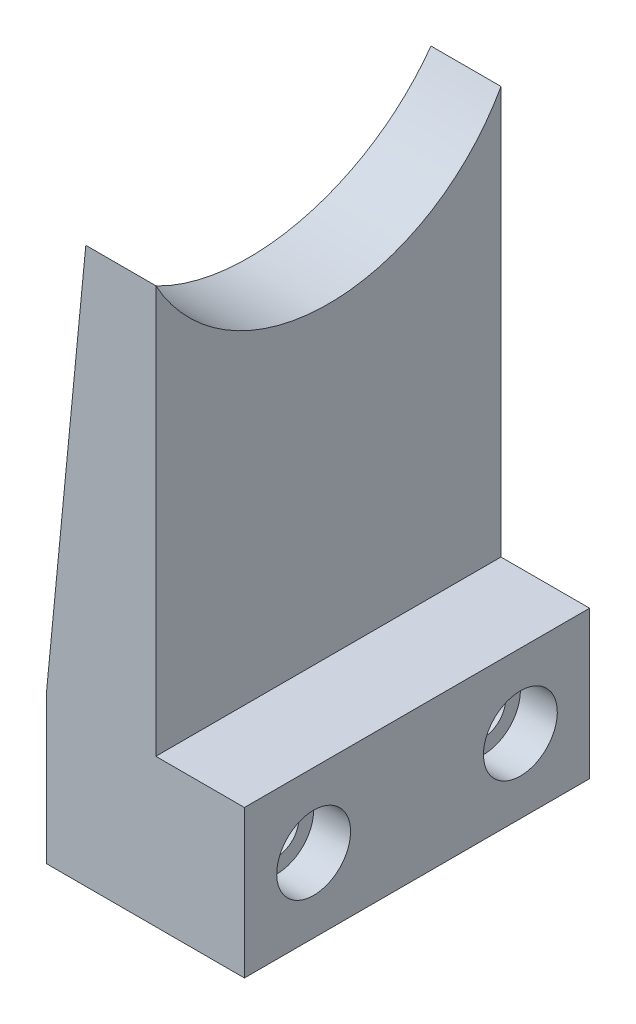
ISO-10303-21;
HEADER;
FILE_DESCRIPTION(('STEP AP214'),'2;1');
FILE_NAME('part.step','',(''),(''),'','','');
FILE_SCHEMA(('AUTOMOTIVE_DESIGN { 1 0 10303 214 1 1 1 1 }'));
ENDSEC;
DATA;
#1=APPLICATION_CONTEXT('core data for automotive mechanical design processes');
#2=APPLICATION_PROTOCOL_DEFINITION('international standard','automotive_design',2000,#1);
#3=PRODUCT_CONTEXT('',#1,'mechanical');
#4=PRODUCT('Part','Part','',(#3));
#5=PRODUCT_RELATED_PRODUCT_CATEGORY('part','',(#4));
#6=PRODUCT_DEFINITION_FORMATION('','',#4);
#7=PRODUCT_DEFINITION_CONTEXT('part definition',#1,'design');
#8=PRODUCT_DEFINITION('design','',#6,#7);
#9=PRODUCT_DEFINITION_SHAPE('','',#8);
#10=(LENGTH_UNIT() NAMED_UNIT(*) SI_UNIT(.MILLI.,.METRE.));
#11=(NAMED_UNIT(*) PLANE_ANGLE_UNIT() SI_UNIT($,.RADIAN.));
#12=(NAMED_UNIT(*) SI_UNIT($,.STERADIAN.) SOLID_ANGLE_UNIT());
#13=UNCERTAINTY_MEASURE_WITH_UNIT(LENGTH_MEASURE(1.E-05),#10,'distance_accuracy_value','');
#14=(GEOMETRIC_REPRESENTATION_CONTEXT(3) GLOBAL_UNCERTAINTY_ASSIGNED_CONTEXT((#13)) GLOBAL_UNIT_ASSIGNED_CONTEXT((#10,
#11,#12)) REPRESENTATION_CONTEXT('',''));
#15=CARTESIAN_POINT('',(0.,0.,0.));
#16=DIRECTION('',(0.,0.,1.));
#17=DIRECTION('',(1.,0.,0.));
#18=AXIS2_PLACEMENT_3D('',#15,#16,#17);
#19=CARTESIAN_POINT('',(0.,0.,35.0588586));
#20=DIRECTION('',(0.,0.,-1.));
#21=DIRECTION('',(-1.,0.,0.));
#22=AXIS2_PLACEMENT_3D('',#19,#20,#21);
#23=PLANE('',#22);
#24=DIRECTION('',(0.0961798870821656,0.995363968265308,0.));
#25=VECTOR('',#24,1.);
#26=CARTESIAN_POINT('',(-15.1396013361024,1.46290723132466,35.0588586));
#27=LINE('',#26,#25);
#28=CARTESIAN_POINT('',(-14.55625,7.49999999999998,35.0588586));
#29=VERTEX_POINT('',#28);
#30=CARTESIAN_POINT('',(-10.55625,48.89593,35.0588586));
#31=VERTEX_POINT('',#30);
#32=EDGE_CURVE('E155',#29,#31,#27,.T.);
#33=ORIENTED_EDGE('',*,*,#32,.F.);
#34=DIRECTION('',(0.,1.,0.));
#35=VECTOR('',#34,1.);
#36=CARTESIAN_POINT('',(-14.55625,0.,35.0588586));
#37=LINE('',#36,#35);
#38=CARTESIAN_POINT('',(-14.55625,-7.5,35.0588586));
#39=VERTEX_POINT('',#38);
#40=EDGE_CURVE('E153',#39,#29,#37,.T.);
#41=ORIENTED_EDGE('',*,*,#40,.F.);
#42=DIRECTION('',(-1.,0.,0.));
#43=VECTOR('',#42,1.);
#44=CARTESIAN_POINT('',(5.55625,-7.5,35.0588586));
#45=LINE('',#44,#43);
#46=CARTESIAN_POINT('',(5.55625,-7.5,35.0588586));
#47=VERTEX_POINT('',#46);
#48=EDGE_CURVE('E209',#47,#39,#45,.T.);
#49=ORIENTED_EDGE('',*,*,#48,.F.);
#50=DIRECTION('',(0.,-1.,0.));
#51=VECTOR('',#50,1.);
#52=CARTESIAN_POINT('',(5.55625,7.5,35.0588586));
#53=LINE('',#52,#51);
#54=CARTESIAN_POINT('',(5.55625,7.5,35.0588586));
#55=VERTEX_POINT('',#54);
#56=EDGE_CURVE('E206',#55,#47,#53,.T.);
#57=ORIENTED_EDGE('',*,*,#56,.F.);
#58=DIRECTION('',(-1.,0.,0.));
#59=VECTOR('',#58,1.);
#60=CARTESIAN_POINT('',(5.55625,7.5,35.0588586));
#61=LINE('',#60,#59);
#62=CARTESIAN_POINT('',(-3.44375,7.5,35.0588586));
#63=VERTEX_POINT('',#62);
#64=EDGE_CURVE('E212',#55,#63,#61,.T.);
#65=ORIENTED_EDGE('',*,*,#64,.T.);
#66=DIRECTION('',(0.,-1.,0.));
#67=VECTOR('',#66,1.);
#68=CARTESIAN_POINT('',(-3.44375,7.5,35.0588586));
#69=LINE('',#68,#67);
#70=CARTESIAN_POINT('',(-3.44375,48.89593,35.0588586));
#71=VERTEX_POINT('',#70);
#72=EDGE_CURVE('E296',#71,#63,#69,.T.);
#73=ORIENTED_EDGE('',*,*,#72,.F.);
#74=DIRECTION('',(1.,0.,0.));
#75=VECTOR('',#74,1.);
#76=CARTESIAN_POINT('',(-68.8033382803833,48.89593,35.0588586));
#77=LINE('',#76,#75);
#78=EDGE_CURVE('E143',#31,#71,#77,.T.);
#79=ORIENTED_EDGE('',*,*,#78,.F.);
#80=EDGE_LOOP('',(#33,#41,#49,#57,#65,#73,#79));
#81=FACE_BOUND('',#80,.T.);
#82=ADVANCED_FACE('F45',(#81),#23,.F.);
#83=CARTESIAN_POINT('',(0.,0.,0.));
#84=DIRECTION('',(0.,0.,-1.));
#85=DIRECTION('',(-1.,0.,0.));
#86=AXIS2_PLACEMENT_3D('',#83,#84,#85);
#87=PLANE('',#86);
#88=DIRECTION('',(0.,-1.,0.));
#89=VECTOR('',#88,1.);
#90=CARTESIAN_POINT('',(-14.55625,0.,0.));
#91=LINE('',#90,#89);
#92=CARTESIAN_POINT('',(-14.55625,7.50000000000004,0.));
#93=VERTEX_POINT('',#92);
#94=CARTESIAN_POINT('',(-14.55625,-7.5,0.));
#95=VERTEX_POINT('',#94);
#96=EDGE_CURVE('E178',#93,#95,#91,.T.);
#97=ORIENTED_EDGE('',*,*,#96,.F.);
#98=DIRECTION('',(0.0961798870821656,0.995363968265308,0.));
#99=VECTOR('',#98,1.);
#100=CARTESIAN_POINT('',(-15.1396013361024,1.46290723132466,0.));
#101=LINE('',#100,#99);
#102=CARTESIAN_POINT('',(-10.55625,48.89593,0.));
#103=VERTEX_POINT('',#102);
#104=EDGE_CURVE('E303',#93,#103,#101,.T.);
#105=ORIENTED_EDGE('',*,*,#104,.T.);
#106=DIRECTION('',(1.,0.,0.));
#107=VECTOR('',#106,1.);
#108=CARTESIAN_POINT('',(-68.8033382803833,48.89593,0.));
#109=LINE('',#108,#107);
#110=CARTESIAN_POINT('',(-3.44375,48.89593,0.));
#111=VERTEX_POINT('',#110);
#112=EDGE_CURVE('E142',#103,#111,#109,.T.);
#113=ORIENTED_EDGE('',*,*,#112,.T.);
#114=DIRECTION('',(0.,1.,0.));
#115=VECTOR('',#114,1.);
#116=CARTESIAN_POINT('',(-3.44375,7.5,0.));
#117=LINE('',#116,#115);
#118=CARTESIAN_POINT('',(-3.44375,7.5,0.));
#119=VERTEX_POINT('',#118);
#120=EDGE_CURVE('E154',#119,#111,#117,.T.);
#121=ORIENTED_EDGE('',*,*,#120,.F.);
#122=DIRECTION('',(-1.,0.,0.));
#123=VECTOR('',#122,1.);
#124=CARTESIAN_POINT('',(5.55625,7.5,0.));
#125=LINE('',#124,#123);
#126=CARTESIAN_POINT('',(5.55625,7.5,0.));
#127=VERTEX_POINT('',#126);
#128=EDGE_CURVE('E210',#127,#119,#125,.T.);
#129=ORIENTED_EDGE('',*,*,#128,.F.);
#130=DIRECTION('',(0.,-1.,0.));
#131=VECTOR('',#130,1.);
#132=CARTESIAN_POINT('',(5.55625,7.5,0.));
#133=LINE('',#132,#131);
#134=CARTESIAN_POINT('',(5.55625,-7.5,0.));
#135=VERTEX_POINT('',#134);
#136=EDGE_CURVE('E202',#127,#135,#133,.T.);
#137=ORIENTED_EDGE('',*,*,#136,.T.);
#138=DIRECTION('',(-1.,0.,0.));
#139=VECTOR('',#138,1.);
#140=CARTESIAN_POINT('',(5.55625,-7.5,0.));
#141=LINE('',#140,#139);
#142=EDGE_CURVE('E217',#135,#95,#141,.T.);
#143=ORIENTED_EDGE('',*,*,#142,.T.);
#144=EDGE_LOOP('',(#97,#105,#113,#121,#129,#137,#143));
#145=FACE_BOUND('',#144,.T.);
#146=ADVANCED_FACE('F249',(#145),#87,.T.);
#147=CARTESIAN_POINT('',(-14.55625,0.,0.));
#148=DIRECTION('',(-1.,0.,0.));
#149=DIRECTION('',(0.,-1.,0.));
#150=AXIS2_PLACEMENT_3D('',#147,#148,#149);
#151=PLANE('',#150);
#152=ORIENTED_EDGE('',*,*,#40,.T.);
#153=DIRECTION('',(0.,0.,-1.));
#154=VECTOR('',#153,1.);
#155=CARTESIAN_POINT('',(-14.55625,7.50000000000004,0.));
#156=LINE('',#155,#154);
#157=CARTESIAN_POINT('',(-14.55625,7.49999999999999,32.5294293));
#158=VERTEX_POINT('',#157);
#159=EDGE_CURVE('E134',#29,#158,#156,.T.);
#160=ORIENTED_EDGE('',*,*,#159,.T.);
#161=DIRECTION('',(0.,-1.,0.));
#162=VECTOR('',#161,1.);
#163=CARTESIAN_POINT('',(-14.55625,0.,32.5294293));
#164=LINE('',#163,#162);
#165=CARTESIAN_POINT('',(-14.55625,-7.5,32.5294293));
#166=VERTEX_POINT('',#165);
#167=EDGE_CURVE('E150',#158,#166,#164,.T.);
#168=ORIENTED_EDGE('',*,*,#167,.T.);
#169=DIRECTION('',(0.,0.,1.));
#170=VECTOR('',#169,1.);
#171=CARTESIAN_POINT('',(-14.55625,-7.5,0.));
#172=LINE('',#171,#170);
#173=EDGE_CURVE('E163',#166,#39,#172,.T.);
#174=ORIENTED_EDGE('',*,*,#173,.T.);
#175=EDGE_LOOP('',(#152,#160,#168,#174));
#176=FACE_BOUND('',#175,.T.);
#177=ADVANCED_FACE('F148',(#176),#151,.T.);
#178=DIRECTION('',(0.,-1.,0.));
#179=VECTOR('',#178,1.);
#180=CARTESIAN_POINT('',(-14.55625,0.,2.5294293));
#181=LINE('',#180,#179);
#182=CARTESIAN_POINT('',(-14.55625,7.5,2.5294293));
#183=VERTEX_POINT('',#182);
#184=CARTESIAN_POINT('',(-14.55625,-7.5,2.5294293));
#185=VERTEX_POINT('',#184);
#186=EDGE_CURVE('E171',#183,#185,#181,.T.);
#187=ORIENTED_EDGE('',*,*,#186,.F.);
#188=EDGE_CURVE('E137',#183,#93,#156,.T.);
#189=ORIENTED_EDGE('',*,*,#188,.T.);
#190=ORIENTED_EDGE('',*,*,#96,.T.);
#191=DIRECTION('',(0.,0.,1.));
#192=VECTOR('',#191,1.);
#193=CARTESIAN_POINT('',(-14.55625,-7.5,0.));
#194=LINE('',#193,#192);
#195=EDGE_CURVE('E180',#95,#185,#194,.T.);
#196=ORIENTED_EDGE('',*,*,#195,.T.);
#197=EDGE_LOOP('',(#187,#189,#190,#196));
#198=FACE_BOUND('',#197,.T.);
#199=ADVANCED_FACE('F306',(#198),#151,.T.);
#200=CARTESIAN_POINT('',(-68.8033382803833,58.5250061974502,17.5294293));
#201=DIRECTION('',(1.,0.,0.));
#202=DIRECTION('',(0.,1.,0.));
#203=AXIS2_PLACEMENT_3D('',#200,#201,#202);
#204=CYLINDRICAL_SURFACE('',#203,20.);
#205=ORIENTED_EDGE('',*,*,#112,.F.);
#206=CARTESIAN_POINT('',(-9.62581300317928,58.5250061974502,17.5294293));
#207=DIRECTION('',(-0.995363968265308,0.0961798870821656,0.));
#208=DIRECTION('',(0.0961798870821656,0.995363968265308,0.));
#209=AXIS2_PLACEMENT_3D('',#206,#207,#208);
#210=ELLIPSE('',#209,20.0931524926057,20.);
#211=EDGE_CURVE('E300',#103,#31,#210,.T.);
#212=ORIENTED_EDGE('',*,*,#211,.T.);
#213=ORIENTED_EDGE('',*,*,#78,.T.);
#214=CARTESIAN_POINT('',(-3.44375000000001,58.5250061974502,17.5294293));
#215=DIRECTION('',(-1.,0.,0.));
#216=DIRECTION('',(0.,1.,0.));
#217=AXIS2_PLACEMENT_3D('',#214,#215,#216);
#218=CIRCLE('',#217,20.);
#219=EDGE_CURVE('E293',#111,#71,#218,.T.);
#220=ORIENTED_EDGE('',*,*,#219,.F.);
#221=EDGE_LOOP('',(#205,#212,#213,#220));
#222=FACE_BOUND('',#221,.T.);
#223=ADVANCED_FACE('F259',(#222),#204,.F.);
#224=CARTESIAN_POINT('',(5.55625,7.5,35.0588586));
#225=DIRECTION('',(0.,-1.,0.));
#226=DIRECTION('',(1.,0.,0.));
#227=AXIS2_PLACEMENT_3D('',#224,#225,#226);
#228=PLANE('',#227);
#229=DIRECTION('',(0.,0.,-1.));
#230=VECTOR('',#229,1.);
#231=CARTESIAN_POINT('',(-3.44375,7.5,0.));
#232=LINE('',#231,#230);
#233=EDGE_CURVE('E62',#63,#119,#232,.T.);
#234=ORIENTED_EDGE('',*,*,#233,.F.);
#235=ORIENTED_EDGE('',*,*,#64,.F.);
#236=DIRECTION('',(0.,0.,-1.));
#237=VECTOR('',#236,1.);
#238=CARTESIAN_POINT('',(5.55625,7.5,35.0588586));
#239=LINE('',#238,#237);
#240=EDGE_CURVE('E11',#55,#127,#239,.T.);
#241=ORIENTED_EDGE('',*,*,#240,.T.);
#242=ORIENTED_EDGE('',*,*,#128,.T.);
#243=EDGE_LOOP('',(#234,#235,#241,#242));
#244=FACE_BOUND('',#243,.T.);
#245=ADVANCED_FACE('F243',(#244),#228,.F.);
#246=CARTESIAN_POINT('',(-5.55625,7.5,35.0588586));
#247=DIRECTION('',(1.,0.,0.));
#248=DIRECTION('',(0.,1.,0.));
#249=AXIS2_PLACEMENT_3D('',#246,#247,#248);
#250=PLANE('',#249);
#251=CARTESIAN_POINT('',(-5.55625,0.,7.0294293));
#252=DIRECTION('',(1.,0.,0.));
#253=DIRECTION('',(0.,1.,0.));
#254=AXIS2_PLACEMENT_3D('',#251,#252,#253);
#255=CIRCLE('',#254,2.25);
#256=CARTESIAN_POINT('',(-5.55625,2.25000000000001,7.0294293));
#257=VERTEX_POINT('',#256);
#258=EDGE_CURVE('E203',#257,#257,#255,.T.);
#259=ORIENTED_EDGE('',*,*,#258,.T.);
#260=EDGE_LOOP('',(#259));
#261=FACE_BOUND('',#260,.T.);
#262=CARTESIAN_POINT('',(-5.55625,0.,28.0294293));
#263=DIRECTION('',(1.,0.,0.));
#264=DIRECTION('',(0.,1.,0.));
#265=AXIS2_PLACEMENT_3D('',#262,#263,#264);
#266=CIRCLE('',#265,2.25);
#267=CARTESIAN_POINT('',(-5.55625,2.25,28.0294293));
#268=VERTEX_POINT('',#267);
#269=EDGE_CURVE('E199',#268,#268,#266,.T.);
#270=ORIENTED_EDGE('',*,*,#269,.T.);
#271=EDGE_LOOP('',(#270));
#272=FACE_BOUND('',#271,.T.);
#273=DIRECTION('',(0.,-1.,0.));
#274=VECTOR('',#273,1.);
#275=CARTESIAN_POINT('',(-5.55625,0.,32.5294293));
#276=LINE('',#275,#274);
#277=CARTESIAN_POINT('',(-5.55625,7.5,32.5294293));
#278=VERTEX_POINT('',#277);
#279=CARTESIAN_POINT('',(-5.55625,-7.5,32.5294293));
#280=VERTEX_POINT('',#279);
#281=EDGE_CURVE('E164',#278,#280,#276,.T.);
#282=ORIENTED_EDGE('',*,*,#281,.F.);
#283=DIRECTION('',(0.,0.,-1.));
#284=VECTOR('',#283,1.);
#285=CARTESIAN_POINT('',(-5.55625,7.5,35.0588586));
#286=LINE('',#285,#284);
#287=CARTESIAN_POINT('',(-5.55625,7.5,2.5294293));
#288=VERTEX_POINT('',#287);
#289=EDGE_CURVE('E54',#278,#288,#286,.T.);
#290=ORIENTED_EDGE('',*,*,#289,.T.);
#291=DIRECTION('',(0.,-1.,0.));
#292=VECTOR('',#291,1.);
#293=CARTESIAN_POINT('',(-5.55625,0.,2.5294293));
#294=LINE('',#293,#292);
#295=CARTESIAN_POINT('',(-5.55625,-7.5,2.5294293));
#296=VERTEX_POINT('',#295);
#297=EDGE_CURVE('E168',#288,#296,#294,.T.);
#298=ORIENTED_EDGE('',*,*,#297,.T.);
#299=DIRECTION('',(0.,0.,-1.));
#300=VECTOR('',#299,1.);
#301=CARTESIAN_POINT('',(-5.55625,-7.5,35.0588586));
#302=LINE('',#301,#300);
#303=EDGE_CURVE('E70',#280,#296,#302,.T.);
#304=ORIENTED_EDGE('',*,*,#303,.F.);
#305=EDGE_LOOP('',(#282,#290,#298,#304));
#306=FACE_BOUND('',#305,.T.);
#307=ADVANCED_FACE('F234',(#261,#272,#306),#250,.F.);
#308=CARTESIAN_POINT('',(-5.55625,0.,7.0294293));
#309=DIRECTION('',(1.,0.,0.));
#310=DIRECTION('',(0.,1.,0.));
#311=AXIS2_PLACEMENT_3D('',#308,#309,#310);
#312=CYLINDRICAL_SURFACE('',#311,2.25);
#313=ORIENTED_EDGE('',*,*,#258,.F.);
#314=EDGE_LOOP('',(#313));
#315=FACE_BOUND('',#314,.T.);
#316=CARTESIAN_POINT('',(1.80625,0.,7.0294293));
#317=DIRECTION('',(1.,0.,0.));
#318=DIRECTION('',(0.,1.,0.));
#319=AXIS2_PLACEMENT_3D('',#316,#317,#318);
#320=CIRCLE('',#319,2.25);
#321=CARTESIAN_POINT('',(1.80625,2.25000000000001,7.0294293));
#322=VERTEX_POINT('',#321);
#323=EDGE_CURVE('E49',#322,#322,#320,.F.);
#324=ORIENTED_EDGE('',*,*,#323,.F.);
#325=EDGE_LOOP('',(#324));
#326=FACE_BOUND('',#325,.T.);
#327=ADVANCED_FACE('F231',(#315,#326),#312,.F.);
#328=CARTESIAN_POINT('',(-5.55625,0.,28.0294293));
#329=DIRECTION('',(1.,0.,0.));
#330=DIRECTION('',(0.,1.,0.));
#331=AXIS2_PLACEMENT_3D('',#328,#329,#330);
#332=CYLINDRICAL_SURFACE('',#331,2.25);
#333=ORIENTED_EDGE('',*,*,#269,.F.);
#334=EDGE_LOOP('',(#333));
#335=FACE_BOUND('',#334,.T.);
#336=CARTESIAN_POINT('',(1.80625,0.,28.0294293));
#337=DIRECTION('',(1.,0.,0.));
#338=DIRECTION('',(0.,1.,0.));
#339=AXIS2_PLACEMENT_3D('',#336,#337,#338);
#340=CIRCLE('',#339,2.25);
#341=CARTESIAN_POINT('',(1.80625,2.25,28.0294293));
#342=VERTEX_POINT('',#341);
#343=EDGE_CURVE('E190',#342,#342,#340,.F.);
#344=ORIENTED_EDGE('',*,*,#343,.F.);
#345=EDGE_LOOP('',(#344));
#346=FACE_BOUND('',#345,.T.);
#347=ADVANCED_FACE('F233',(#335,#346),#332,.F.);
#348=CARTESIAN_POINT('',(5.55625,7.5,35.0588586));
#349=DIRECTION('',(1.,0.,0.));
#350=DIRECTION('',(0.,1.,0.));
#351=AXIS2_PLACEMENT_3D('',#348,#349,#350);
#352=PLANE('',#351);
#353=CARTESIAN_POINT('',(5.55625,0.,28.0294293));
#354=DIRECTION('',(1.,0.,0.));
#355=DIRECTION('',(0.,1.,0.));
#356=AXIS2_PLACEMENT_3D('',#353,#354,#355);
#357=CIRCLE('',#356,3.75);
#358=CARTESIAN_POINT('',(5.55625,3.75,28.0294293));
#359=VERTEX_POINT('',#358);
#360=EDGE_CURVE('E191',#359,#359,#357,.T.);
#361=ORIENTED_EDGE('',*,*,#360,.F.);
#362=EDGE_LOOP('',(#361));
#363=FACE_BOUND('',#362,.T.);
#364=CARTESIAN_POINT('',(5.55625,0.,7.0294293));
#365=DIRECTION('',(1.,0.,0.));
#366=DIRECTION('',(0.,1.,0.));
#367=AXIS2_PLACEMENT_3D('',#364,#365,#366);
#368=CIRCLE('',#367,3.75);
#369=CARTESIAN_POINT('',(5.55625,3.75000000000001,7.0294293));
#370=VERTEX_POINT('',#369);
#371=EDGE_CURVE('E186',#370,#370,#368,.T.);
#372=ORIENTED_EDGE('',*,*,#371,.F.);
#373=EDGE_LOOP('',(#372));
#374=FACE_BOUND('',#373,.T.);
#375=ORIENTED_EDGE('',*,*,#136,.F.);
#376=ORIENTED_EDGE('',*,*,#240,.F.);
#377=ORIENTED_EDGE('',*,*,#56,.T.);
#378=DIRECTION('',(0.,0.,-1.));
#379=VECTOR('',#378,1.);
#380=CARTESIAN_POINT('',(5.55625,-7.5,35.0588586));
#381=LINE('',#380,#379);
#382=EDGE_CURVE('E214',#47,#135,#381,.T.);
#383=ORIENTED_EDGE('',*,*,#382,.T.);
#384=EDGE_LOOP('',(#375,#376,#377,#383));
#385=FACE_BOUND('',#384,.T.);
#386=ADVANCED_FACE('F47',(#363,#374,#385),#352,.T.);
#387=CARTESIAN_POINT('',(5.55625,-7.5,35.0588586));
#388=DIRECTION('',(0.,-1.,0.));
#389=DIRECTION('',(1.,0.,0.));
#390=AXIS2_PLACEMENT_3D('',#387,#388,#389);
#391=PLANE('',#390);
#392=ORIENTED_EDGE('',*,*,#142,.F.);
#393=ORIENTED_EDGE('',*,*,#382,.F.);
#394=ORIENTED_EDGE('',*,*,#48,.T.);
#395=ORIENTED_EDGE('',*,*,#173,.F.);
#396=DIRECTION('',(1.,0.,0.));
#397=VECTOR('',#396,1.);
#398=CARTESIAN_POINT('',(-14.55625,-7.5,32.5294293));
#399=LINE('',#398,#397);
#400=EDGE_CURVE('E161',#166,#280,#399,.T.);
#401=ORIENTED_EDGE('',*,*,#400,.T.);
#402=ORIENTED_EDGE('',*,*,#303,.T.);
#403=DIRECTION('',(1.,0.,0.));
#404=VECTOR('',#403,1.);
#405=CARTESIAN_POINT('',(-14.55625,-7.5,2.5294293));
#406=LINE('',#405,#404);
#407=EDGE_CURVE('E181',#185,#296,#406,.T.);
#408=ORIENTED_EDGE('',*,*,#407,.F.);
#409=ORIENTED_EDGE('',*,*,#195,.F.);
#410=EDGE_LOOP('',(#392,#393,#394,#395,#401,#402,#408,#409));
#411=FACE_BOUND('',#410,.T.);
#412=ADVANCED_FACE('F260',(#411),#391,.T.);
#413=CARTESIAN_POINT('',(1.80625,0.,28.0294293));
#414=DIRECTION('',(1.,0.,0.));
#415=DIRECTION('',(0.,1.,0.));
#416=AXIS2_PLACEMENT_3D('',#413,#414,#415);
#417=PLANE('',#416);
#418=CARTESIAN_POINT('',(1.80625,0.,28.0294293));
#419=DIRECTION('',(1.,0.,0.));
#420=DIRECTION('',(0.,1.,0.));
#421=AXIS2_PLACEMENT_3D('',#418,#419,#420);
#422=CIRCLE('',#421,3.75);
#423=CARTESIAN_POINT('',(1.80625,3.75,28.0294293));
#424=VERTEX_POINT('',#423);
#425=EDGE_CURVE('E187',#424,#424,#422,.T.);
#426=ORIENTED_EDGE('',*,*,#425,.T.);
#427=EDGE_LOOP('',(#426));
#428=FACE_BOUND('',#427,.T.);
#429=ORIENTED_EDGE('',*,*,#343,.T.);
#430=EDGE_LOOP('',(#429));
#431=FACE_BOUND('',#430,.T.);
#432=ADVANCED_FACE('F262',(#428,#431),#417,.T.);
#433=CARTESIAN_POINT('',(1.80625,0.,28.0294293));
#434=DIRECTION('',(1.,0.,0.));
#435=DIRECTION('',(0.,1.,0.));
#436=AXIS2_PLACEMENT_3D('',#433,#434,#435);
#437=CYLINDRICAL_SURFACE('',#436,3.75);
#438=ORIENTED_EDGE('',*,*,#425,.F.);
#439=EDGE_LOOP('',(#438));
#440=FACE_BOUND('',#439,.T.);
#441=ORIENTED_EDGE('',*,*,#360,.T.);
#442=EDGE_LOOP('',(#441));
#443=FACE_BOUND('',#442,.T.);
#444=ADVANCED_FACE('F267',(#440,#443),#437,.F.);
#445=CARTESIAN_POINT('',(1.80625,0.,7.0294293));
#446=DIRECTION('',(1.,0.,0.));
#447=DIRECTION('',(0.,1.,0.));
#448=AXIS2_PLACEMENT_3D('',#445,#446,#447);
#449=PLANE('',#448);
#450=CARTESIAN_POINT('',(1.80625,0.,7.0294293));
#451=DIRECTION('',(1.,0.,0.));
#452=DIRECTION('',(0.,1.,0.));
#453=AXIS2_PLACEMENT_3D('',#450,#451,#452);
#454=CIRCLE('',#453,3.75);
#455=CARTESIAN_POINT('',(1.80625,3.75000000000001,7.0294293));
#456=VERTEX_POINT('',#455);
#457=EDGE_CURVE('E194',#456,#456,#454,.T.);
#458=ORIENTED_EDGE('',*,*,#457,.T.);
#459=EDGE_LOOP('',(#458));
#460=FACE_BOUND('',#459,.T.);
#461=ORIENTED_EDGE('',*,*,#323,.T.);
#462=EDGE_LOOP('',(#461));
#463=FACE_BOUND('',#462,.T.);
#464=ADVANCED_FACE('F229',(#460,#463),#449,.T.);
#465=CARTESIAN_POINT('',(1.80625,0.,7.0294293));
#466=DIRECTION('',(1.,0.,0.));
#467=DIRECTION('',(0.,1.,0.));
#468=AXIS2_PLACEMENT_3D('',#465,#466,#467);
#469=CYLINDRICAL_SURFACE('',#468,3.75);
#470=ORIENTED_EDGE('',*,*,#457,.F.);
#471=EDGE_LOOP('',(#470));
#472=FACE_BOUND('',#471,.T.);
#473=ORIENTED_EDGE('',*,*,#371,.T.);
#474=EDGE_LOOP('',(#473));
#475=FACE_BOUND('',#474,.T.);
#476=ADVANCED_FACE('F326',(#472,#475),#469,.F.);
#477=CARTESIAN_POINT('',(-14.55625,0.,2.5294293));
#478=DIRECTION('',(0.,0.,1.));
#479=DIRECTION('',(0.,-1.,0.));
#480=AXIS2_PLACEMENT_3D('',#477,#478,#479);
#481=PLANE('',#480);
#482=ORIENTED_EDGE('',*,*,#297,.F.);
#483=DIRECTION('',(1.,0.,0.));
#484=VECTOR('',#483,1.);
#485=CARTESIAN_POINT('',(-14.55625,7.5,2.5294293));
#486=LINE('',#485,#484);
#487=EDGE_CURVE('E184',#183,#288,#486,.T.);
#488=ORIENTED_EDGE('',*,*,#487,.F.);
#489=ORIENTED_EDGE('',*,*,#186,.T.);
#490=ORIENTED_EDGE('',*,*,#407,.T.);
#491=EDGE_LOOP('',(#482,#488,#489,#490));
#492=FACE_BOUND('',#491,.T.);
#493=ADVANCED_FACE('F317',(#492),#481,.T.);
#494=CARTESIAN_POINT('',(-14.55625,0.,32.5294293));
#495=DIRECTION('',(0.,0.,1.));
#496=DIRECTION('',(1.,0.,0.));
#497=AXIS2_PLACEMENT_3D('',#494,#495,#496);
#498=PLANE('',#497);
#499=ORIENTED_EDGE('',*,*,#281,.T.);
#500=ORIENTED_EDGE('',*,*,#400,.F.);
#501=ORIENTED_EDGE('',*,*,#167,.F.);
#502=DIRECTION('',(1.,0.,0.));
#503=VECTOR('',#502,1.);
#504=CARTESIAN_POINT('',(-14.55625,7.5,32.5294293));
#505=LINE('',#504,#503);
#506=EDGE_CURVE('E159',#158,#278,#505,.T.);
#507=ORIENTED_EDGE('',*,*,#506,.T.);
#508=EDGE_LOOP('',(#499,#500,#501,#507));
#509=FACE_BOUND('',#508,.T.);
#510=ADVANCED_FACE('F158',(#509),#498,.F.);
#511=CARTESIAN_POINT('',(-3.44375000000001,58.5250061974502,17.5294293));
#512=DIRECTION('',(1.,0.,0.));
#513=DIRECTION('',(0.,1.,0.));
#514=AXIS2_PLACEMENT_3D('',#511,#512,#513);
#515=PLANE('',#514);
#516=ORIENTED_EDGE('',*,*,#120,.T.);
#517=ORIENTED_EDGE('',*,*,#219,.T.);
#518=ORIENTED_EDGE('',*,*,#72,.T.);
#519=ORIENTED_EDGE('',*,*,#233,.T.);
#520=EDGE_LOOP('',(#516,#517,#518,#519));
#521=FACE_BOUND('',#520,.T.);
#522=ADVANCED_FACE('F310',(#521),#515,.T.);
#523=CARTESIAN_POINT('',(-68.8033382803833,7.49999999999999,0.));
#524=DIRECTION('',(0.,-1.,0.));
#525=DIRECTION('',(0.,0.,-1.));
#526=AXIS2_PLACEMENT_3D('',#523,#524,#525);
#527=PLANE('',#526);
#528=DIRECTION('',(0.,0.,-1.));
#529=VECTOR('',#528,1.);
#530=CARTESIAN_POINT('',(-14.55625,7.5,0.));
#531=LINE('',#530,#529);
#532=EDGE_CURVE('E131',#158,#183,#531,.T.);
#533=ORIENTED_EDGE('',*,*,#532,.T.);
#534=ORIENTED_EDGE('',*,*,#487,.T.);
#535=ORIENTED_EDGE('',*,*,#289,.F.);
#536=ORIENTED_EDGE('',*,*,#506,.F.);
#537=EDGE_LOOP('',(#533,#534,#535,#536));
#538=FACE_BOUND('',#537,.T.);
#539=ADVANCED_FACE('F167',(#538),#527,.T.);
#540=CARTESIAN_POINT('',(-15.1396013361024,1.46290723132466,0.));
#541=DIRECTION('',(-0.995363968265308,0.0961798870821656,0.));
#542=DIRECTION('',(-0.0961798870821656,-0.995363968265308,0.));
#543=AXIS2_PLACEMENT_3D('',#540,#541,#542);
#544=PLANE('',#543);
#545=ORIENTED_EDGE('',*,*,#32,.T.);
#546=ORIENTED_EDGE('',*,*,#211,.F.);
#547=ORIENTED_EDGE('',*,*,#104,.F.);
#548=ORIENTED_EDGE('',*,*,#188,.F.);
#549=ORIENTED_EDGE('',*,*,#532,.F.);
#550=ORIENTED_EDGE('',*,*,#159,.F.);
#551=EDGE_LOOP('',(#545,#546,#547,#548,#549,#550));
#552=FACE_BOUND('',#551,.T.);
#553=ADVANCED_FACE('F133',(#552),#544,.T.);
#554=CLOSED_SHELL('',(#82,#146,#177,#199,#223,#245,#307,#327,#347,#386,#412,#432,#444,#464,#476,
#493,#510,#522,#539,#553));
#555=MANIFOLD_SOLID_BREP('B2',#554);
#556=ADVANCED_BREP_SHAPE_REPRESENTATION('',(#18,#555),#14);
#557=SHAPE_DEFINITION_REPRESENTATION(#9,#556);
ENDSEC;
END-ISO-10303-21;
